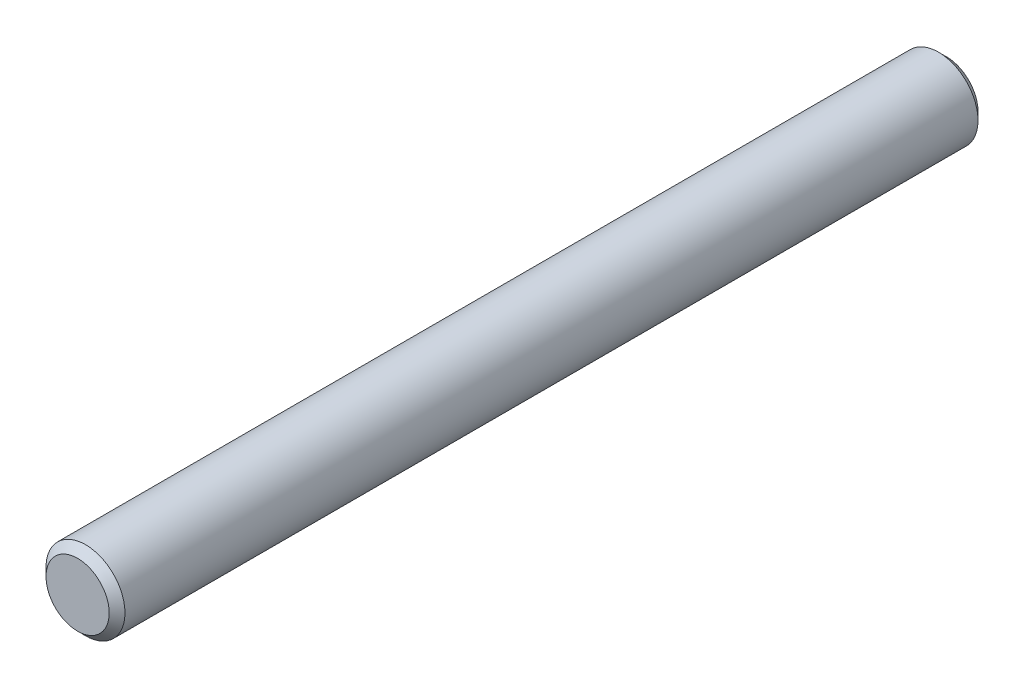
ISO-10303-21;
HEADER;
FILE_DESCRIPTION(('STEP AP214'),'2;1');
FILE_NAME('part.step','',(''),(''),'','','');
FILE_SCHEMA(('AUTOMOTIVE_DESIGN { 1 0 10303 214 1 1 1 1 }'));
ENDSEC;
DATA;
#1=APPLICATION_CONTEXT('core data for automotive mechanical design processes');
#2=APPLICATION_PROTOCOL_DEFINITION('international standard','automotive_design',2000,#1);
#3=PRODUCT_CONTEXT('',#1,'mechanical');
#4=PRODUCT('Part','Part','',(#3));
#5=PRODUCT_RELATED_PRODUCT_CATEGORY('part','',(#4));
#6=PRODUCT_DEFINITION_FORMATION('','',#4);
#7=PRODUCT_DEFINITION_CONTEXT('part definition',#1,'design');
#8=PRODUCT_DEFINITION('design','',#6,#7);
#9=PRODUCT_DEFINITION_SHAPE('','',#8);
#10=(LENGTH_UNIT() NAMED_UNIT(*) SI_UNIT(.MILLI.,.METRE.));
#11=(NAMED_UNIT(*) PLANE_ANGLE_UNIT() SI_UNIT($,.RADIAN.));
#12=(NAMED_UNIT(*) SI_UNIT($,.STERADIAN.) SOLID_ANGLE_UNIT());
#13=UNCERTAINTY_MEASURE_WITH_UNIT(LENGTH_MEASURE(1.E-05),#10,'distance_accuracy_value','');
#14=(GEOMETRIC_REPRESENTATION_CONTEXT(3) GLOBAL_UNCERTAINTY_ASSIGNED_CONTEXT((#13)) GLOBAL_UNIT_ASSIGNED_CONTEXT((#10,
#11,#12)) REPRESENTATION_CONTEXT('',''));
#15=CARTESIAN_POINT('',(0.,0.,0.));
#16=DIRECTION('',(0.,0.,1.));
#17=DIRECTION('',(1.,0.,0.));
#18=AXIS2_PLACEMENT_3D('',#15,#16,#17);
#19=CARTESIAN_POINT('',(0.,0.,55.));
#20=DIRECTION('',(0.,0.,-1.));
#21=DIRECTION('',(-1.,0.,0.));
#22=AXIS2_PLACEMENT_3D('',#19,#20,#21);
#23=CYLINDRICAL_SURFACE('',#22,2.5);
#24=CARTESIAN_POINT('',(0.,0.,0.5));
#25=DIRECTION('',(0.,0.,1.));
#26=DIRECTION('',(1.,0.,0.));
#27=AXIS2_PLACEMENT_3D('',#24,#25,#26);
#28=CIRCLE('',#27,2.5);
#29=CARTESIAN_POINT('',(2.5,0.,0.5));
#30=VERTEX_POINT('',#29);
#31=EDGE_CURVE('E41',#30,#30,#28,.T.);
#32=ORIENTED_EDGE('',*,*,#31,.T.);
#33=EDGE_LOOP('',(#32));
#34=FACE_BOUND('',#33,.T.);
#35=CARTESIAN_POINT('',(0.,0.,54.5));
#36=DIRECTION('',(0.,0.,1.));
#37=DIRECTION('',(1.,0.,0.));
#38=AXIS2_PLACEMENT_3D('',#35,#36,#37);
#39=CIRCLE('',#38,2.5);
#40=CARTESIAN_POINT('',(2.5,0.,54.5));
#41=VERTEX_POINT('',#40);
#42=EDGE_CURVE('E45',#41,#41,#39,.F.);
#43=ORIENTED_EDGE('',*,*,#42,.T.);
#44=EDGE_LOOP('',(#43));
#45=FACE_BOUND('',#44,.T.);
#46=ADVANCED_FACE('F30',(#34,#45),#23,.T.);
#47=CARTESIAN_POINT('',(0.,0.,55.));
#48=DIRECTION('',(0.,0.,1.));
#49=DIRECTION('',(1.,0.,0.));
#50=AXIS2_PLACEMENT_3D('',#47,#48,#49);
#51=PLANE('',#50);
#52=CARTESIAN_POINT('',(0.,0.,55.));
#53=DIRECTION('',(0.,0.,1.));
#54=DIRECTION('',(1.,0.,0.));
#55=AXIS2_PLACEMENT_3D('',#52,#53,#54);
#56=CIRCLE('',#55,1.99999999999998);
#57=CARTESIAN_POINT('',(1.99999999999998,0.,55.));
#58=VERTEX_POINT('',#57);
#59=EDGE_CURVE('E10',#58,#58,#56,.T.);
#60=ORIENTED_EDGE('',*,*,#59,.T.);
#61=EDGE_LOOP('',(#60));
#62=FACE_BOUND('',#61,.T.);
#63=ADVANCED_FACE('F61',(#62),#51,.T.);
#64=CARTESIAN_POINT('',(0.,0.,0.));
#65=DIRECTION('',(0.,0.,1.));
#66=DIRECTION('',(1.,0.,0.));
#67=AXIS2_PLACEMENT_3D('',#64,#65,#66);
#68=PLANE('',#67);
#69=CARTESIAN_POINT('',(0.,0.,0.));
#70=DIRECTION('',(0.,0.,1.));
#71=DIRECTION('',(1.,0.,0.));
#72=AXIS2_PLACEMENT_3D('',#69,#70,#71);
#73=CIRCLE('',#72,1.99999999999999);
#74=CARTESIAN_POINT('',(1.99999999999999,0.,0.));
#75=VERTEX_POINT('',#74);
#76=EDGE_CURVE('E37',#75,#75,#73,.F.);
#77=ORIENTED_EDGE('',*,*,#76,.T.);
#78=EDGE_LOOP('',(#77));
#79=FACE_BOUND('',#78,.T.);
#80=ADVANCED_FACE('F58',(#79),#68,.F.);
#81=CARTESIAN_POINT('',(0.,0.,0.5));
#82=DIRECTION('',(0.,0.,1.));
#83=DIRECTION('',(1.,0.,0.));
#84=AXIS2_PLACEMENT_3D('',#81,#82,#83);
#85=CONICAL_SURFACE('',#84,2.5,0.785398163397453);
#86=ORIENTED_EDGE('',*,*,#76,.F.);
#87=EDGE_LOOP('',(#86));
#88=FACE_BOUND('',#87,.T.);
#89=ORIENTED_EDGE('',*,*,#31,.F.);
#90=EDGE_LOOP('',(#89));
#91=FACE_BOUND('',#90,.T.);
#92=ADVANCED_FACE('F54',(#88,#91),#85,.T.);
#93=CARTESIAN_POINT('',(0.,0.,55.));
#94=DIRECTION('',(0.,0.,-1.));
#95=DIRECTION('',(-1.,0.,0.));
#96=AXIS2_PLACEMENT_3D('',#93,#94,#95);
#97=CONICAL_SURFACE('',#96,1.99999999999998,0.785398163397453);
#98=ORIENTED_EDGE('',*,*,#42,.F.);
#99=EDGE_LOOP('',(#98));
#100=FACE_BOUND('',#99,.T.);
#101=ORIENTED_EDGE('',*,*,#59,.F.);
#102=EDGE_LOOP('',(#101));
#103=FACE_BOUND('',#102,.T.);
#104=ADVANCED_FACE('F32',(#100,#103),#97,.T.);
#105=CLOSED_SHELL('',(#46,#63,#80,#92,#104));
#106=MANIFOLD_SOLID_BREP('B2',#105);
#107=ADVANCED_BREP_SHAPE_REPRESENTATION('',(#18,#106),#14);
#108=SHAPE_DEFINITION_REPRESENTATION(#9,#107);
ENDSEC;
END-ISO-10303-21;
